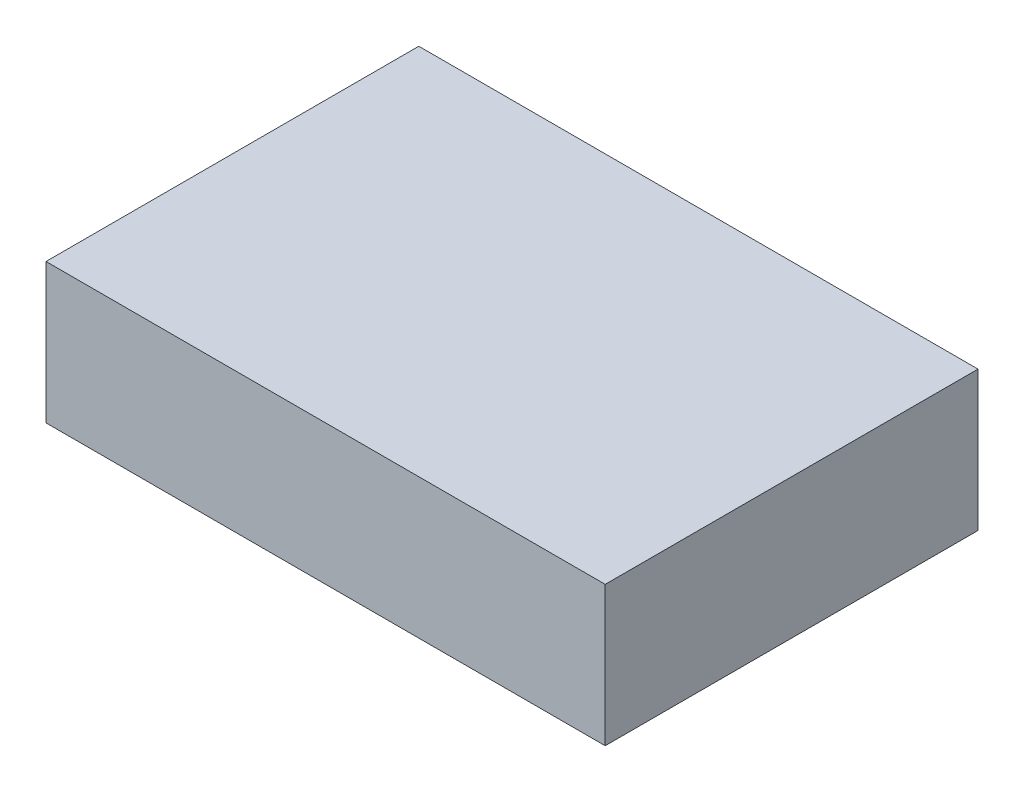
ISO-10303-21;
HEADER;
FILE_DESCRIPTION(('STEP AP214'),'2;1');
FILE_NAME('part.step','',(''),(''),'','','');
FILE_SCHEMA(('AUTOMOTIVE_DESIGN { 1 0 10303 214 1 1 1 1 }'));
ENDSEC;
DATA;
#1=APPLICATION_CONTEXT('core data for automotive mechanical design processes');
#2=APPLICATION_PROTOCOL_DEFINITION('international standard','automotive_design',2000,#1);
#3=PRODUCT_CONTEXT('',#1,'mechanical');
#4=PRODUCT('Part','Part','',(#3));
#5=PRODUCT_RELATED_PRODUCT_CATEGORY('part','',(#4));
#6=PRODUCT_DEFINITION_FORMATION('','',#4);
#7=PRODUCT_DEFINITION_CONTEXT('part definition',#1,'design');
#8=PRODUCT_DEFINITION('design','',#6,#7);
#9=PRODUCT_DEFINITION_SHAPE('','',#8);
#10=(LENGTH_UNIT() NAMED_UNIT(*) SI_UNIT(.MILLI.,.METRE.));
#11=(NAMED_UNIT(*) PLANE_ANGLE_UNIT() SI_UNIT($,.RADIAN.));
#12=(NAMED_UNIT(*) SI_UNIT($,.STERADIAN.) SOLID_ANGLE_UNIT());
#13=UNCERTAINTY_MEASURE_WITH_UNIT(LENGTH_MEASURE(1.E-05),#10,'distance_accuracy_value','');
#14=(GEOMETRIC_REPRESENTATION_CONTEXT(3) GLOBAL_UNCERTAINTY_ASSIGNED_CONTEXT((#13)) GLOBAL_UNIT_ASSIGNED_CONTEXT((#10,
#11,#12)) REPRESENTATION_CONTEXT('',''));
#15=CARTESIAN_POINT('',(0.,0.,0.));
#16=DIRECTION('',(0.,0.,1.));
#17=DIRECTION('',(1.,0.,0.));
#18=AXIS2_PLACEMENT_3D('',#15,#16,#17);
#19=CARTESIAN_POINT('',(-45.1303155006859,-6.85871056241427,80.));
#20=DIRECTION('',(0.,1.,0.));
#21=DIRECTION('',(0.,0.,1.));
#22=AXIS2_PLACEMENT_3D('',#19,#20,#21);
#23=PLANE('',#22);
#24=DIRECTION('',(1.,0.,0.));
#25=VECTOR('',#24,1.);
#26=CARTESIAN_POINT('',(-45.1303155006859,-6.85871056241427,0.));
#27=LINE('',#26,#25);
#28=CARTESIAN_POINT('',(-45.1303155006859,-6.85871056241427,0.));
#29=VERTEX_POINT('',#28);
#30=CARTESIAN_POINT('',(74.8696844993141,-6.85871056241427,0.));
#31=VERTEX_POINT('',#30);
#32=EDGE_CURVE('E162',#29,#31,#27,.T.);
#33=ORIENTED_EDGE('',*,*,#32,.T.);
#34=DIRECTION('',(0.,0.,-1.));
#35=VECTOR('',#34,1.);
#36=CARTESIAN_POINT('',(74.8696844993141,-6.85871056241427,80.));
#37=LINE('',#36,#35);
#38=CARTESIAN_POINT('',(74.8696844993141,-6.85871056241427,80.));
#39=VERTEX_POINT('',#38);
#40=EDGE_CURVE('E44',#39,#31,#37,.T.);
#41=ORIENTED_EDGE('',*,*,#40,.F.);
#42=DIRECTION('',(1.,0.,0.));
#43=VECTOR('',#42,1.);
#44=CARTESIAN_POINT('',(-45.1303155006859,-6.85871056241427,80.));
#45=LINE('',#44,#43);
#46=CARTESIAN_POINT('',(-45.1303155006859,-6.85871056241427,80.));
#47=VERTEX_POINT('',#46);
#48=EDGE_CURVE('E88',#47,#39,#45,.T.);
#49=ORIENTED_EDGE('',*,*,#48,.F.);
#50=DIRECTION('',(0.,0.,-1.));
#51=VECTOR('',#50,1.);
#52=CARTESIAN_POINT('',(-45.1303155006859,-6.85871056241427,80.));
#53=LINE('',#52,#51);
#54=EDGE_CURVE('E11',#47,#29,#53,.T.);
#55=ORIENTED_EDGE('',*,*,#54,.T.);
#56=EDGE_LOOP('',(#33,#41,#49,#55));
#57=FACE_BOUND('',#56,.T.);
#58=DIRECTION('',(1.,0.,0.));
#59=VECTOR('',#58,1.);
#60=CARTESIAN_POINT('',(-45.1303155006859,-6.85871056241427,5.));
#61=LINE('',#60,#59);
#62=CARTESIAN_POINT('',(-40.1303155006859,-6.85871056241427,5.));
#63=VERTEX_POINT('',#62);
#64=CARTESIAN_POINT('',(69.8696844993141,-6.85871056241427,5.));
#65=VERTEX_POINT('',#64);
#66=EDGE_CURVE('E132',#63,#65,#61,.T.);
#67=ORIENTED_EDGE('',*,*,#66,.F.);
#68=DIRECTION('',(0.,0.,-1.));
#69=VECTOR('',#68,1.);
#70=CARTESIAN_POINT('',(-40.1303155006859,-6.85871056241427,80.));
#71=LINE('',#70,#69);
#72=CARTESIAN_POINT('',(-40.1303155006859,-6.85871056241427,75.));
#73=VERTEX_POINT('',#72);
#74=EDGE_CURVE('E131',#73,#63,#71,.T.);
#75=ORIENTED_EDGE('',*,*,#74,.F.);
#76=DIRECTION('',(1.,0.,0.));
#77=VECTOR('',#76,1.);
#78=CARTESIAN_POINT('',(-45.1303155006859,-6.85871056241427,75.));
#79=LINE('',#78,#77);
#80=CARTESIAN_POINT('',(69.8696844993141,-6.85871056241427,75.));
#81=VERTEX_POINT('',#80);
#82=EDGE_CURVE('E139',#73,#81,#79,.T.);
#83=ORIENTED_EDGE('',*,*,#82,.T.);
#84=DIRECTION('',(0.,0.,-1.));
#85=VECTOR('',#84,1.);
#86=CARTESIAN_POINT('',(69.8696844993141,-6.85871056241427,80.));
#87=LINE('',#86,#85);
#88=EDGE_CURVE('E144',#81,#65,#87,.T.);
#89=ORIENTED_EDGE('',*,*,#88,.T.);
#90=EDGE_LOOP('',(#67,#75,#83,#89));
#91=FACE_BOUND('',#90,.T.);
#92=ADVANCED_FACE('F35',(#57,#91),#23,.F.);
#93=CARTESIAN_POINT('',(-45.1303155006859,23.1412894375857,80.));
#94=DIRECTION('',(1.,0.,0.));
#95=DIRECTION('',(0.,0.,-1.));
#96=AXIS2_PLACEMENT_3D('',#93,#94,#95);
#97=PLANE('',#96);
#98=DIRECTION('',(0.,-1.,0.));
#99=VECTOR('',#98,1.);
#100=CARTESIAN_POINT('',(-45.1303155006859,23.1412894375857,0.));
#101=LINE('',#100,#99);
#102=CARTESIAN_POINT('',(-45.1303155006859,23.1412894375857,0.));
#103=VERTEX_POINT('',#102);
#104=EDGE_CURVE('E147',#103,#29,#101,.T.);
#105=ORIENTED_EDGE('',*,*,#104,.T.);
#106=ORIENTED_EDGE('',*,*,#54,.F.);
#107=DIRECTION('',(0.,-1.,0.));
#108=VECTOR('',#107,1.);
#109=CARTESIAN_POINT('',(-45.1303155006859,23.1412894375857,80.));
#110=LINE('',#109,#108);
#111=CARTESIAN_POINT('',(-45.1303155006859,23.1412894375857,80.));
#112=VERTEX_POINT('',#111);
#113=EDGE_CURVE('E153',#112,#47,#110,.T.);
#114=ORIENTED_EDGE('',*,*,#113,.F.);
#115=DIRECTION('',(0.,0.,-1.));
#116=VECTOR('',#115,1.);
#117=CARTESIAN_POINT('',(-45.1303155006859,23.1412894375857,80.));
#118=LINE('',#117,#116);
#119=EDGE_CURVE('E159',#112,#103,#118,.T.);
#120=ORIENTED_EDGE('',*,*,#119,.T.);
#121=EDGE_LOOP('',(#105,#106,#114,#120));
#122=FACE_BOUND('',#121,.T.);
#123=ADVANCED_FACE('F37',(#122),#97,.F.);
#124=CARTESIAN_POINT('',(74.8696844993141,23.1412894375857,80.));
#125=DIRECTION('',(-1.,0.,0.));
#126=DIRECTION('',(0.,0.,1.));
#127=AXIS2_PLACEMENT_3D('',#124,#125,#126);
#128=PLANE('',#127);
#129=DIRECTION('',(0.,1.,0.));
#130=VECTOR('',#129,1.);
#131=CARTESIAN_POINT('',(74.8696844993141,23.1412894375857,0.));
#132=LINE('',#131,#130);
#133=CARTESIAN_POINT('',(74.8696844993141,23.1412894375857,0.));
#134=VERTEX_POINT('',#133);
#135=EDGE_CURVE('E164',#31,#134,#132,.T.);
#136=ORIENTED_EDGE('',*,*,#135,.T.);
#137=DIRECTION('',(0.,0.,-1.));
#138=VECTOR('',#137,1.);
#139=CARTESIAN_POINT('',(74.8696844993141,23.1412894375857,80.));
#140=LINE('',#139,#138);
#141=CARTESIAN_POINT('',(74.8696844993141,23.1412894375857,80.));
#142=VERTEX_POINT('',#141);
#143=EDGE_CURVE('E168',#142,#134,#140,.T.);
#144=ORIENTED_EDGE('',*,*,#143,.F.);
#145=DIRECTION('',(0.,1.,0.));
#146=VECTOR('',#145,1.);
#147=CARTESIAN_POINT('',(74.8696844993141,23.1412894375857,80.));
#148=LINE('',#147,#146);
#149=EDGE_CURVE('E156',#39,#142,#148,.T.);
#150=ORIENTED_EDGE('',*,*,#149,.F.);
#151=ORIENTED_EDGE('',*,*,#40,.T.);
#152=EDGE_LOOP('',(#136,#144,#150,#151));
#153=FACE_BOUND('',#152,.T.);
#154=ADVANCED_FACE('F174',(#153),#128,.F.);
#155=CARTESIAN_POINT('',(-45.1303155006859,23.1412894375857,80.));
#156=DIRECTION('',(0.,-1.,0.));
#157=DIRECTION('',(0.,0.,-1.));
#158=AXIS2_PLACEMENT_3D('',#155,#156,#157);
#159=PLANE('',#158);
#160=DIRECTION('',(-1.,0.,0.));
#161=VECTOR('',#160,1.);
#162=CARTESIAN_POINT('',(-45.1303155006859,23.1412894375857,0.));
#163=LINE('',#162,#161);
#164=EDGE_CURVE('E81',#134,#103,#163,.T.);
#165=ORIENTED_EDGE('',*,*,#164,.T.);
#166=ORIENTED_EDGE('',*,*,#119,.F.);
#167=DIRECTION('',(-1.,0.,0.));
#168=VECTOR('',#167,1.);
#169=CARTESIAN_POINT('',(-45.1303155006859,23.1412894375857,80.));
#170=LINE('',#169,#168);
#171=EDGE_CURVE('E60',#142,#112,#170,.T.);
#172=ORIENTED_EDGE('',*,*,#171,.F.);
#173=ORIENTED_EDGE('',*,*,#143,.T.);
#174=EDGE_LOOP('',(#165,#166,#172,#173));
#175=FACE_BOUND('',#174,.T.);
#176=ADVANCED_FACE('F182',(#175),#159,.F.);
#177=CARTESIAN_POINT('',(0.,0.,80.));
#178=DIRECTION('',(0.,0.,1.));
#179=DIRECTION('',(1.,0.,0.));
#180=AXIS2_PLACEMENT_3D('',#177,#178,#179);
#181=PLANE('',#180);
#182=ORIENTED_EDGE('',*,*,#113,.T.);
#183=ORIENTED_EDGE('',*,*,#48,.T.);
#184=ORIENTED_EDGE('',*,*,#149,.T.);
#185=ORIENTED_EDGE('',*,*,#171,.T.);
#186=EDGE_LOOP('',(#182,#183,#184,#185));
#187=FACE_BOUND('',#186,.T.);
#188=ADVANCED_FACE('F184',(#187),#181,.T.);
#189=CARTESIAN_POINT('',(0.,0.,0.));
#190=DIRECTION('',(0.,0.,1.));
#191=DIRECTION('',(1.,0.,0.));
#192=AXIS2_PLACEMENT_3D('',#189,#190,#191);
#193=PLANE('',#192);
#194=CARTESIAN_POINT('',(-30.1303155006859,7.81447199125043,0.));
#195=DIRECTION('',(0.,0.,-1.));
#196=DIRECTION('',(-1.,0.,0.));
#197=AXIS2_PLACEMENT_3D('',#194,#195,#196);
#198=CIRCLE('',#197,4.17592014993846);
#199=CARTESIAN_POINT('',(-34.3062356506243,7.81447199125043,0.));
#200=VERTEX_POINT('',#199);
#201=EDGE_CURVE('E136',#200,#200,#198,.T.);
#202=ORIENTED_EDGE('',*,*,#201,.F.);
#203=EDGE_LOOP('',(#202));
#204=FACE_BOUND('',#203,.T.);
#205=ORIENTED_EDGE('',*,*,#104,.F.);
#206=ORIENTED_EDGE('',*,*,#164,.F.);
#207=ORIENTED_EDGE('',*,*,#135,.F.);
#208=ORIENTED_EDGE('',*,*,#32,.F.);
#209=EDGE_LOOP('',(#205,#206,#207,#208));
#210=FACE_BOUND('',#209,.T.);
#211=ADVANCED_FACE('F178',(#204,#210),#193,.F.);
#212=CARTESIAN_POINT('',(-40.1303155006859,23.1412894375857,80.));
#213=DIRECTION('',(1.,0.,0.));
#214=DIRECTION('',(0.,0.,-1.));
#215=AXIS2_PLACEMENT_3D('',#212,#213,#214);
#216=PLANE('',#215);
#217=DIRECTION('',(0.,-1.,0.));
#218=VECTOR('',#217,1.);
#219=CARTESIAN_POINT('',(-40.1303155006859,23.1412894375857,5.));
#220=LINE('',#219,#218);
#221=CARTESIAN_POINT('',(-40.1303155006859,18.1412894375857,5.));
#222=VERTEX_POINT('',#221);
#223=EDGE_CURVE('E115',#222,#63,#220,.T.);
#224=ORIENTED_EDGE('',*,*,#223,.F.);
#225=DIRECTION('',(0.,0.,-1.));
#226=VECTOR('',#225,1.);
#227=CARTESIAN_POINT('',(-40.1303155006859,18.1412894375857,80.));
#228=LINE('',#227,#226);
#229=CARTESIAN_POINT('',(-40.1303155006859,18.1412894375857,75.));
#230=VERTEX_POINT('',#229);
#231=EDGE_CURVE('E123',#230,#222,#228,.T.);
#232=ORIENTED_EDGE('',*,*,#231,.F.);
#233=DIRECTION('',(0.,-1.,0.));
#234=VECTOR('',#233,1.);
#235=CARTESIAN_POINT('',(-40.1303155006859,23.1412894375857,75.));
#236=LINE('',#235,#234);
#237=EDGE_CURVE('E51',#230,#73,#236,.T.);
#238=ORIENTED_EDGE('',*,*,#237,.T.);
#239=ORIENTED_EDGE('',*,*,#74,.T.);
#240=EDGE_LOOP('',(#224,#232,#238,#239));
#241=FACE_BOUND('',#240,.T.);
#242=ADVANCED_FACE('F129',(#241),#216,.T.);
#243=CARTESIAN_POINT('',(69.8696844993141,23.1412894375857,80.));
#244=DIRECTION('',(-1.,0.,0.));
#245=DIRECTION('',(0.,0.,1.));
#246=AXIS2_PLACEMENT_3D('',#243,#244,#245);
#247=PLANE('',#246);
#248=DIRECTION('',(0.,1.,0.));
#249=VECTOR('',#248,1.);
#250=CARTESIAN_POINT('',(69.8696844993141,23.1412894375857,5.));
#251=LINE('',#250,#249);
#252=CARTESIAN_POINT('',(69.8696844993141,18.1412894375857,5.));
#253=VERTEX_POINT('',#252);
#254=EDGE_CURVE('E118',#65,#253,#251,.T.);
#255=ORIENTED_EDGE('',*,*,#254,.F.);
#256=ORIENTED_EDGE('',*,*,#88,.F.);
#257=DIRECTION('',(0.,1.,0.));
#258=VECTOR('',#257,1.);
#259=CARTESIAN_POINT('',(69.8696844993141,23.1412894375857,75.));
#260=LINE('',#259,#258);
#261=CARTESIAN_POINT('',(69.8696844993141,18.1412894375857,75.));
#262=VERTEX_POINT('',#261);
#263=EDGE_CURVE('E142',#81,#262,#260,.T.);
#264=ORIENTED_EDGE('',*,*,#263,.T.);
#265=DIRECTION('',(0.,0.,-1.));
#266=VECTOR('',#265,1.);
#267=CARTESIAN_POINT('',(69.8696844993141,18.1412894375857,80.));
#268=LINE('',#267,#266);
#269=EDGE_CURVE('E127',#262,#253,#268,.T.);
#270=ORIENTED_EDGE('',*,*,#269,.T.);
#271=EDGE_LOOP('',(#255,#256,#264,#270));
#272=FACE_BOUND('',#271,.T.);
#273=ADVANCED_FACE('F199',(#272),#247,.T.);
#274=CARTESIAN_POINT('',(-45.1303155006859,18.1412894375857,80.));
#275=DIRECTION('',(0.,-1.,0.));
#276=DIRECTION('',(0.,0.,-1.));
#277=AXIS2_PLACEMENT_3D('',#274,#275,#276);
#278=PLANE('',#277);
#279=DIRECTION('',(-1.,0.,0.));
#280=VECTOR('',#279,1.);
#281=CARTESIAN_POINT('',(-45.1303155006859,18.1412894375857,5.));
#282=LINE('',#281,#280);
#283=EDGE_CURVE('E111',#253,#222,#282,.T.);
#284=ORIENTED_EDGE('',*,*,#283,.F.);
#285=ORIENTED_EDGE('',*,*,#269,.F.);
#286=DIRECTION('',(-1.,0.,0.));
#287=VECTOR('',#286,1.);
#288=CARTESIAN_POINT('',(-45.1303155006859,18.1412894375857,75.));
#289=LINE('',#288,#287);
#290=EDGE_CURVE('E126',#262,#230,#289,.T.);
#291=ORIENTED_EDGE('',*,*,#290,.T.);
#292=ORIENTED_EDGE('',*,*,#231,.T.);
#293=EDGE_LOOP('',(#284,#285,#291,#292));
#294=FACE_BOUND('',#293,.T.);
#295=ADVANCED_FACE('F124',(#294),#278,.T.);
#296=CARTESIAN_POINT('',(0.,0.,75.));
#297=DIRECTION('',(0.,0.,1.));
#298=DIRECTION('',(1.,0.,0.));
#299=AXIS2_PLACEMENT_3D('',#296,#297,#298);
#300=PLANE('',#299);
#301=ORIENTED_EDGE('',*,*,#237,.F.);
#302=ORIENTED_EDGE('',*,*,#290,.F.);
#303=ORIENTED_EDGE('',*,*,#263,.F.);
#304=ORIENTED_EDGE('',*,*,#82,.F.);
#305=EDGE_LOOP('',(#301,#302,#303,#304));
#306=FACE_BOUND('',#305,.T.);
#307=ADVANCED_FACE('F202',(#306),#300,.F.);
#308=CARTESIAN_POINT('',(0.,0.,5.));
#309=DIRECTION('',(0.,0.,1.));
#310=DIRECTION('',(1.,0.,0.));
#311=AXIS2_PLACEMENT_3D('',#308,#309,#310);
#312=PLANE('',#311);
#313=CARTESIAN_POINT('',(-30.1303155006859,7.81447199125043,5.));
#314=DIRECTION('',(0.,0.,1.));
#315=DIRECTION('',(1.,0.,0.));
#316=AXIS2_PLACEMENT_3D('',#313,#314,#315);
#317=CIRCLE('',#316,4.17592014993846);
#318=CARTESIAN_POINT('',(-25.9543953507474,7.81447199125043,5.));
#319=VERTEX_POINT('',#318);
#320=EDGE_CURVE('E39',#319,#319,#317,.T.);
#321=ORIENTED_EDGE('',*,*,#320,.F.);
#322=EDGE_LOOP('',(#321));
#323=FACE_BOUND('',#322,.T.);
#324=ORIENTED_EDGE('',*,*,#223,.T.);
#325=ORIENTED_EDGE('',*,*,#66,.T.);
#326=ORIENTED_EDGE('',*,*,#254,.T.);
#327=ORIENTED_EDGE('',*,*,#283,.T.);
#328=EDGE_LOOP('',(#324,#325,#326,#327));
#329=FACE_BOUND('',#328,.T.);
#330=ADVANCED_FACE('F113',(#323,#329),#312,.T.);
#331=CARTESIAN_POINT('',(-30.1303155006859,7.81447199125043,15.));
#332=DIRECTION('',(0.,0.,-1.));
#333=DIRECTION('',(-1.,0.,0.));
#334=AXIS2_PLACEMENT_3D('',#331,#332,#333);
#335=CYLINDRICAL_SURFACE('',#334,4.17592014993846);
#336=ORIENTED_EDGE('',*,*,#320,.T.);
#337=EDGE_LOOP('',(#336));
#338=FACE_BOUND('',#337,.T.);
#339=ORIENTED_EDGE('',*,*,#201,.T.);
#340=EDGE_LOOP('',(#339));
#341=FACE_BOUND('',#340,.T.);
#342=ADVANCED_FACE('F209',(#338,#341),#335,.F.);
#343=CLOSED_SHELL('',(#92,#123,#154,#176,#188,#211,#242,#273,#295,#307,#330,#342));
#344=MANIFOLD_SOLID_BREP('B2',#343);
#345=ADVANCED_BREP_SHAPE_REPRESENTATION('',(#18,#344),#14);
#346=SHAPE_DEFINITION_REPRESENTATION(#9,#345);
ENDSEC;
END-ISO-10303-21;
